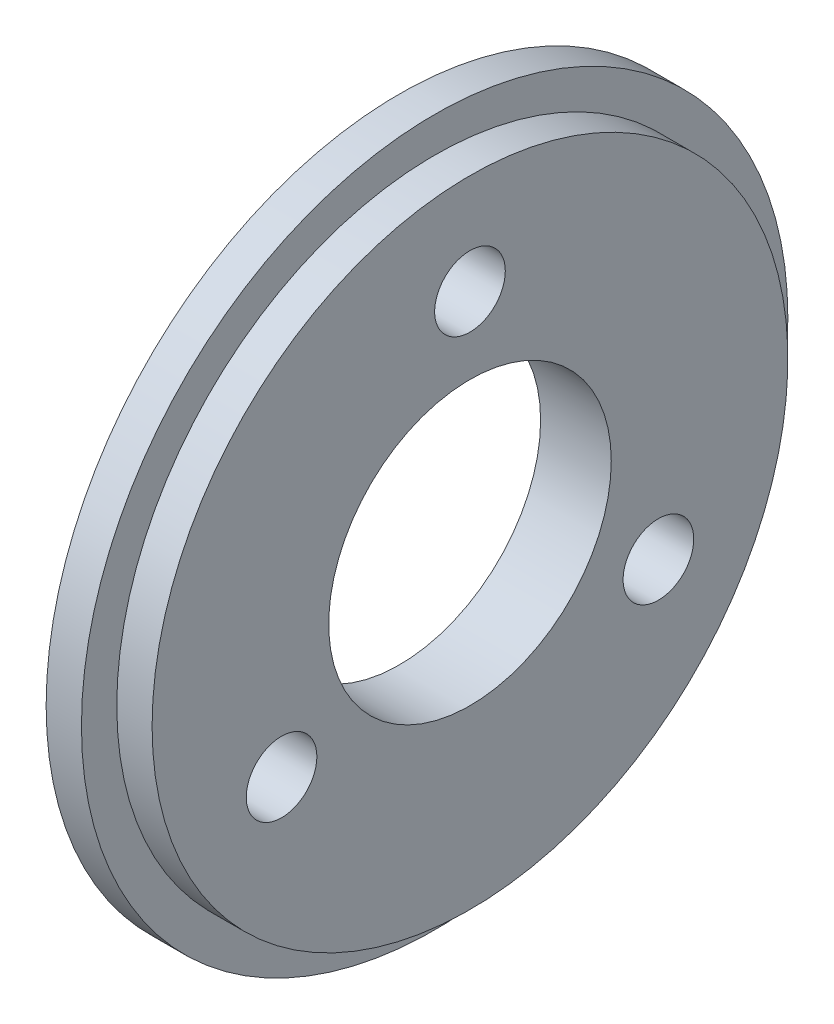
ISO-10303-21;
HEADER;
FILE_DESCRIPTION(('STEP AP214'),'2;1');
FILE_NAME('part.step','',(''),(''),'','','');
FILE_SCHEMA(('AUTOMOTIVE_DESIGN { 1 0 10303 214 1 1 1 1 }'));
ENDSEC;
DATA;
#1=APPLICATION_CONTEXT('core data for automotive mechanical design processes');
#2=APPLICATION_PROTOCOL_DEFINITION('international standard','automotive_design',2000,#1);
#3=PRODUCT_CONTEXT('',#1,'mechanical');
#4=PRODUCT('Part','Part','',(#3));
#5=PRODUCT_RELATED_PRODUCT_CATEGORY('part','',(#4));
#6=PRODUCT_DEFINITION_FORMATION('','',#4);
#7=PRODUCT_DEFINITION_CONTEXT('part definition',#1,'design');
#8=PRODUCT_DEFINITION('design','',#6,#7);
#9=PRODUCT_DEFINITION_SHAPE('','',#8);
#10=(LENGTH_UNIT() NAMED_UNIT(*) SI_UNIT(.MILLI.,.METRE.));
#11=(NAMED_UNIT(*) PLANE_ANGLE_UNIT() SI_UNIT($,.RADIAN.));
#12=(NAMED_UNIT(*) SI_UNIT($,.STERADIAN.) SOLID_ANGLE_UNIT());
#13=UNCERTAINTY_MEASURE_WITH_UNIT(LENGTH_MEASURE(1.E-05),#10,'distance_accuracy_value','');
#14=(GEOMETRIC_REPRESENTATION_CONTEXT(3) GLOBAL_UNCERTAINTY_ASSIGNED_CONTEXT((#13)) GLOBAL_UNIT_ASSIGNED_CONTEXT((#10,
#11,#12)) REPRESENTATION_CONTEXT('',''));
#15=CARTESIAN_POINT('',(0.,0.,0.));
#16=DIRECTION('',(0.,0.,1.));
#17=DIRECTION('',(1.,0.,0.));
#18=AXIS2_PLACEMENT_3D('',#15,#16,#17);
#19=CARTESIAN_POINT('',(-12.7,-19.5579999999986,-33.8754496944346));
#20=DIRECTION('',(1.,0.,0.));
#21=DIRECTION('',(0.,0.,-1.));
#22=AXIS2_PLACEMENT_3D('',#19,#20,#21);
#23=CYLINDRICAL_SURFACE('',#22,3.4925);
#24=CARTESIAN_POINT('',(-12.7,-19.5579999999986,-33.8754496944346));
#25=DIRECTION('',(1.,0.,0.));
#26=DIRECTION('',(0.,0.,-1.));
#27=AXIS2_PLACEMENT_3D('',#24,#25,#26);
#28=CIRCLE('',#27,3.4925);
#29=CARTESIAN_POINT('',(-12.7,-19.5579999999986,-37.3679496944346));
#30=VERTEX_POINT('',#29);
#31=EDGE_CURVE('E72',#30,#30,#28,.T.);
#32=ORIENTED_EDGE('',*,*,#31,.F.);
#33=EDGE_LOOP('',(#32));
#34=FACE_BOUND('',#33,.T.);
#35=CARTESIAN_POINT('',(-10.16,-19.5579999999986,-33.8754496944346));
#36=DIRECTION('',(1.,0.,0.));
#37=DIRECTION('',(0.,0.,-1.));
#38=AXIS2_PLACEMENT_3D('',#35,#36,#37);
#39=CIRCLE('',#38,3.4925);
#40=CARTESIAN_POINT('',(-10.16,-19.5579999999986,-37.3679496944346));
#41=VERTEX_POINT('',#40);
#42=EDGE_CURVE('E104',#41,#41,#39,.T.);
#43=ORIENTED_EDGE('',*,*,#42,.T.);
#44=EDGE_LOOP('',(#43));
#45=FACE_BOUND('',#44,.T.);
#46=ADVANCED_FACE('F43',(#34,#45),#23,.F.);
#47=CARTESIAN_POINT('',(-12.7,-19.5580000000014,33.8754496944296));
#48=DIRECTION('',(1.,0.,0.));
#49=DIRECTION('',(0.,0.,-1.));
#50=AXIS2_PLACEMENT_3D('',#47,#48,#49);
#51=CYLINDRICAL_SURFACE('',#50,3.4925);
#52=CARTESIAN_POINT('',(-12.7,-19.5580000000014,33.8754496944296));
#53=DIRECTION('',(1.,0.,0.));
#54=DIRECTION('',(0.,0.,-1.));
#55=AXIS2_PLACEMENT_3D('',#52,#53,#54);
#56=CIRCLE('',#55,3.4925);
#57=CARTESIAN_POINT('',(-12.7,-19.5580000000014,30.3829496944296));
#58=VERTEX_POINT('',#57);
#59=EDGE_CURVE('E68',#58,#58,#56,.T.);
#60=ORIENTED_EDGE('',*,*,#59,.F.);
#61=EDGE_LOOP('',(#60));
#62=FACE_BOUND('',#61,.T.);
#63=CARTESIAN_POINT('',(-10.16,-19.5580000000014,33.8754496944296));
#64=DIRECTION('',(1.,0.,0.));
#65=DIRECTION('',(0.,0.,-1.));
#66=AXIS2_PLACEMENT_3D('',#63,#64,#65);
#67=CIRCLE('',#66,3.4925);
#68=CARTESIAN_POINT('',(-10.16,-19.5580000000014,30.3829496944296));
#69=VERTEX_POINT('',#68);
#70=EDGE_CURVE('E92',#69,#69,#67,.T.);
#71=ORIENTED_EDGE('',*,*,#70,.T.);
#72=EDGE_LOOP('',(#71));
#73=FACE_BOUND('',#72,.T.);
#74=ADVANCED_FACE('F164',(#62,#73),#51,.F.);
#75=CARTESIAN_POINT('',(-12.7,39.116,0.));
#76=DIRECTION('',(1.,0.,0.));
#77=DIRECTION('',(0.,0.,-1.));
#78=AXIS2_PLACEMENT_3D('',#75,#76,#77);
#79=CYLINDRICAL_SURFACE('',#78,3.4925);
#80=CARTESIAN_POINT('',(-12.7,39.116,0.));
#81=DIRECTION('',(1.,0.,0.));
#82=DIRECTION('',(0.,0.,-1.));
#83=AXIS2_PLACEMENT_3D('',#80,#81,#82);
#84=CIRCLE('',#83,3.4925);
#85=CARTESIAN_POINT('',(-12.7,39.116,-3.4925));
#86=VERTEX_POINT('',#85);
#87=EDGE_CURVE('E67',#86,#86,#84,.T.);
#88=ORIENTED_EDGE('',*,*,#87,.F.);
#89=EDGE_LOOP('',(#88));
#90=FACE_BOUND('',#89,.T.);
#91=CARTESIAN_POINT('',(-10.16,39.116,0.));
#92=DIRECTION('',(1.,0.,0.));
#93=DIRECTION('',(0.,0.,-1.));
#94=AXIS2_PLACEMENT_3D('',#91,#92,#93);
#95=CIRCLE('',#94,3.4925);
#96=CARTESIAN_POINT('',(-10.16,39.116,-3.4925));
#97=VERTEX_POINT('',#96);
#98=EDGE_CURVE('E116',#97,#97,#95,.T.);
#99=ORIENTED_EDGE('',*,*,#98,.T.);
#100=EDGE_LOOP('',(#99));
#101=FACE_BOUND('',#100,.T.);
#102=ADVANCED_FACE('F124',(#90,#101),#79,.F.);
#103=CARTESIAN_POINT('',(0.,0.,0.));
#104=DIRECTION('',(-1.,0.,0.));
#105=DIRECTION('',(0.,0.,1.));
#106=AXIS2_PLACEMENT_3D('',#103,#104,#105);
#107=PLANE('',#106);
#108=CARTESIAN_POINT('',(0.,39.116,0.));
#109=DIRECTION('',(1.,0.,0.));
#110=DIRECTION('',(0.,0.,-1.));
#111=AXIS2_PLACEMENT_3D('',#108,#109,#110);
#112=CIRCLE('',#111,6.35);
#113=CARTESIAN_POINT('',(0.,39.116,-6.35));
#114=VERTEX_POINT('',#113);
#115=EDGE_CURVE('E109',#114,#114,#112,.T.);
#116=ORIENTED_EDGE('',*,*,#115,.F.);
#117=EDGE_LOOP('',(#116));
#118=FACE_BOUND('',#117,.T.);
#119=CARTESIAN_POINT('',(0.,-19.557999999999,-33.8754496944338));
#120=DIRECTION('',(1.,0.,0.));
#121=DIRECTION('',(0.,0.,-1.));
#122=AXIS2_PLACEMENT_3D('',#119,#120,#121);
#123=CIRCLE('',#122,6.35);
#124=CARTESIAN_POINT('',(0.,-19.557999999999,-40.2254496944338));
#125=VERTEX_POINT('',#124);
#126=EDGE_CURVE('E97',#125,#125,#123,.T.);
#127=ORIENTED_EDGE('',*,*,#126,.F.);
#128=EDGE_LOOP('',(#127));
#129=FACE_BOUND('',#128,.T.);
#130=CARTESIAN_POINT('',(0.,-19.5580000000009,33.8754496944305));
#131=DIRECTION('',(1.,0.,0.));
#132=DIRECTION('',(0.,0.,-1.));
#133=AXIS2_PLACEMENT_3D('',#130,#131,#132);
#134=CIRCLE('',#133,6.35);
#135=CARTESIAN_POINT('',(0.,-19.5580000000009,27.5254496944305));
#136=VERTEX_POINT('',#135);
#137=EDGE_CURVE('E88',#136,#136,#134,.T.);
#138=ORIENTED_EDGE('',*,*,#137,.F.);
#139=EDGE_LOOP('',(#138));
#140=FACE_BOUND('',#139,.T.);
#141=CARTESIAN_POINT('',(0.,0.,0.));
#142=DIRECTION('',(1.,0.,0.));
#143=DIRECTION('',(0.,0.,-1.));
#144=AXIS2_PLACEMENT_3D('',#141,#142,#143);
#145=CIRCLE('',#144,25.4);
#146=CARTESIAN_POINT('',(0.,0.,-25.4));
#147=VERTEX_POINT('',#146);
#148=EDGE_CURVE('E77',#147,#147,#145,.T.);
#149=ORIENTED_EDGE('',*,*,#148,.F.);
#150=EDGE_LOOP('',(#149));
#151=FACE_BOUND('',#150,.T.);
#152=CARTESIAN_POINT('',(0.,0.,0.));
#153=DIRECTION('',(-1.,0.,0.));
#154=DIRECTION('',(0.,0.,1.));
#155=AXIS2_PLACEMENT_3D('',#152,#153,#154);
#156=CIRCLE('',#155,57.15);
#157=CARTESIAN_POINT('',(0.,0.,57.15));
#158=VERTEX_POINT('',#157);
#159=EDGE_CURVE('E10',#158,#158,#156,.T.);
#160=ORIENTED_EDGE('',*,*,#159,.F.);
#161=EDGE_LOOP('',(#160));
#162=FACE_BOUND('',#161,.T.);
#163=ADVANCED_FACE('F45',(#118,#129,#140,#151,#162),#107,.F.);
#164=CARTESIAN_POINT('',(0.,0.,0.));
#165=DIRECTION('',(-1.,0.,0.));
#166=DIRECTION('',(0.,0.,1.));
#167=AXIS2_PLACEMENT_3D('',#164,#165,#166);
#168=CYLINDRICAL_SURFACE('',#167,57.15);
#169=CARTESIAN_POINT('',(-6.35,0.,0.));
#170=DIRECTION('',(-1.,0.,0.));
#171=DIRECTION('',(0.,0.,1.));
#172=AXIS2_PLACEMENT_3D('',#169,#170,#171);
#173=CIRCLE('',#172,57.15);
#174=CARTESIAN_POINT('',(-6.35,0.,57.15));
#175=VERTEX_POINT('',#174);
#176=EDGE_CURVE('E51',#175,#175,#173,.T.);
#177=ORIENTED_EDGE('',*,*,#176,.F.);
#178=EDGE_LOOP('',(#177));
#179=FACE_BOUND('',#178,.T.);
#180=ORIENTED_EDGE('',*,*,#159,.T.);
#181=EDGE_LOOP('',(#180));
#182=FACE_BOUND('',#181,.T.);
#183=ADVANCED_FACE('F142',(#179,#182),#168,.T.);
#184=CARTESIAN_POINT('',(-6.35,57.15,0.));
#185=DIRECTION('',(-1.,0.,0.));
#186=DIRECTION('',(0.,0.,1.));
#187=AXIS2_PLACEMENT_3D('',#184,#185,#186);
#188=PLANE('',#187);
#189=CARTESIAN_POINT('',(-6.35,0.,0.));
#190=DIRECTION('',(-1.,0.,0.));
#191=DIRECTION('',(0.,0.,1.));
#192=AXIS2_PLACEMENT_3D('',#189,#190,#191);
#193=CIRCLE('',#192,63.5);
#194=CARTESIAN_POINT('',(-6.35,0.,63.5));
#195=VERTEX_POINT('',#194);
#196=EDGE_CURVE('E56',#195,#195,#193,.T.);
#197=ORIENTED_EDGE('',*,*,#196,.F.);
#198=EDGE_LOOP('',(#197));
#199=FACE_BOUND('',#198,.T.);
#200=ORIENTED_EDGE('',*,*,#176,.T.);
#201=EDGE_LOOP('',(#200));
#202=FACE_BOUND('',#201,.T.);
#203=ADVANCED_FACE('F176',(#199,#202),#188,.F.);
#204=CARTESIAN_POINT('',(0.,0.,0.));
#205=DIRECTION('',(-1.,0.,0.));
#206=DIRECTION('',(0.,0.,1.));
#207=AXIS2_PLACEMENT_3D('',#204,#205,#206);
#208=CYLINDRICAL_SURFACE('',#207,63.5);
#209=CARTESIAN_POINT('',(-12.7,0.,0.));
#210=DIRECTION('',(-1.,0.,0.));
#211=DIRECTION('',(0.,0.,1.));
#212=AXIS2_PLACEMENT_3D('',#209,#210,#211);
#213=CIRCLE('',#212,63.5);
#214=CARTESIAN_POINT('',(-12.7,0.,63.5));
#215=VERTEX_POINT('',#214);
#216=EDGE_CURVE('E61',#215,#215,#213,.T.);
#217=ORIENTED_EDGE('',*,*,#216,.F.);
#218=EDGE_LOOP('',(#217));
#219=FACE_BOUND('',#218,.T.);
#220=ORIENTED_EDGE('',*,*,#196,.T.);
#221=EDGE_LOOP('',(#220));
#222=FACE_BOUND('',#221,.T.);
#223=ADVANCED_FACE('F158',(#219,#222),#208,.T.);
#224=CARTESIAN_POINT('',(-12.7,63.5,0.));
#225=DIRECTION('',(1.,0.,0.));
#226=DIRECTION('',(0.,0.,-1.));
#227=AXIS2_PLACEMENT_3D('',#224,#225,#226);
#228=PLANE('',#227);
#229=ORIENTED_EDGE('',*,*,#87,.T.);
#230=EDGE_LOOP('',(#229));
#231=FACE_BOUND('',#230,.T.);
#232=CARTESIAN_POINT('',(-12.7,0.,0.));
#233=DIRECTION('',(1.,0.,0.));
#234=DIRECTION('',(0.,0.,-1.));
#235=AXIS2_PLACEMENT_3D('',#232,#233,#234);
#236=CIRCLE('',#235,25.4);
#237=CARTESIAN_POINT('',(-12.7,0.,-25.4));
#238=VERTEX_POINT('',#237);
#239=EDGE_CURVE('E73',#238,#238,#236,.T.);
#240=ORIENTED_EDGE('',*,*,#239,.T.);
#241=EDGE_LOOP('',(#240));
#242=FACE_BOUND('',#241,.T.);
#243=ORIENTED_EDGE('',*,*,#59,.T.);
#244=EDGE_LOOP('',(#243));
#245=FACE_BOUND('',#244,.T.);
#246=ORIENTED_EDGE('',*,*,#31,.T.);
#247=EDGE_LOOP('',(#246));
#248=FACE_BOUND('',#247,.T.);
#249=ORIENTED_EDGE('',*,*,#216,.T.);
#250=EDGE_LOOP('',(#249));
#251=FACE_BOUND('',#250,.T.);
#252=ADVANCED_FACE('F151',(#231,#242,#245,#248,#251),#228,.F.);
#253=CARTESIAN_POINT('',(-12.7,0.,0.));
#254=DIRECTION('',(1.,0.,0.));
#255=DIRECTION('',(0.,0.,-1.));
#256=AXIS2_PLACEMENT_3D('',#253,#254,#255);
#257=CYLINDRICAL_SURFACE('',#256,25.4);
#258=ORIENTED_EDGE('',*,*,#239,.F.);
#259=EDGE_LOOP('',(#258));
#260=FACE_BOUND('',#259,.T.);
#261=ORIENTED_EDGE('',*,*,#148,.T.);
#262=EDGE_LOOP('',(#261));
#263=FACE_BOUND('',#262,.T.);
#264=ADVANCED_FACE('F136',(#260,#263),#257,.F.);
#265=CARTESIAN_POINT('',(-10.16,39.116,0.));
#266=DIRECTION('',(1.,0.,0.));
#267=DIRECTION('',(0.,0.,-1.));
#268=AXIS2_PLACEMENT_3D('',#265,#266,#267);
#269=CYLINDRICAL_SURFACE('',#268,6.35);
#270=CARTESIAN_POINT('',(-10.16,39.116,0.));
#271=DIRECTION('',(1.,0.,0.));
#272=DIRECTION('',(0.,0.,-1.));
#273=AXIS2_PLACEMENT_3D('',#270,#271,#272);
#274=CIRCLE('',#273,6.35);
#275=CARTESIAN_POINT('',(-10.16,39.116,-6.35));
#276=VERTEX_POINT('',#275);
#277=EDGE_CURVE('E81',#276,#276,#274,.T.);
#278=ORIENTED_EDGE('',*,*,#277,.F.);
#279=EDGE_LOOP('',(#278));
#280=FACE_BOUND('',#279,.T.);
#281=ORIENTED_EDGE('',*,*,#115,.T.);
#282=EDGE_LOOP('',(#281));
#283=FACE_BOUND('',#282,.T.);
#284=ADVANCED_FACE('F130',(#280,#283),#269,.F.);
#285=CARTESIAN_POINT('',(-10.16,0.,0.));
#286=DIRECTION('',(1.,0.,0.));
#287=DIRECTION('',(0.,0.,-1.));
#288=AXIS2_PLACEMENT_3D('',#285,#286,#287);
#289=PLANE('',#288);
#290=ORIENTED_EDGE('',*,*,#98,.F.);
#291=EDGE_LOOP('',(#290));
#292=FACE_BOUND('',#291,.T.);
#293=ORIENTED_EDGE('',*,*,#277,.T.);
#294=EDGE_LOOP('',(#293));
#295=FACE_BOUND('',#294,.T.);
#296=ADVANCED_FACE('F126',(#292,#295),#289,.T.);
#297=CARTESIAN_POINT('',(-10.16,-19.5580000000009,33.8754496944305));
#298=DIRECTION('',(1.,0.,0.));
#299=DIRECTION('',(0.,0.,-1.));
#300=AXIS2_PLACEMENT_3D('',#297,#298,#299);
#301=CYLINDRICAL_SURFACE('',#300,6.35);
#302=CARTESIAN_POINT('',(-10.16,-19.5580000000009,33.8754496944305));
#303=DIRECTION('',(1.,0.,0.));
#304=DIRECTION('',(0.,0.,-1.));
#305=AXIS2_PLACEMENT_3D('',#302,#303,#304);
#306=CIRCLE('',#305,6.35);
#307=CARTESIAN_POINT('',(-10.16,-19.5580000000009,27.5254496944305));
#308=VERTEX_POINT('',#307);
#309=EDGE_CURVE('E93',#308,#308,#306,.T.);
#310=ORIENTED_EDGE('',*,*,#309,.F.);
#311=EDGE_LOOP('',(#310));
#312=FACE_BOUND('',#311,.T.);
#313=ORIENTED_EDGE('',*,*,#137,.T.);
#314=EDGE_LOOP('',(#313));
#315=FACE_BOUND('',#314,.T.);
#316=ADVANCED_FACE('F129',(#312,#315),#301,.F.);
#317=CARTESIAN_POINT('',(-10.16,0.,0.));
#318=DIRECTION('',(1.,0.,0.));
#319=DIRECTION('',(0.,0.,-1.));
#320=AXIS2_PLACEMENT_3D('',#317,#318,#319);
#321=PLANE('',#320);
#322=ORIENTED_EDGE('',*,*,#70,.F.);
#323=EDGE_LOOP('',(#322));
#324=FACE_BOUND('',#323,.T.);
#325=ORIENTED_EDGE('',*,*,#309,.T.);
#326=EDGE_LOOP('',(#325));
#327=FACE_BOUND('',#326,.T.);
#328=ADVANCED_FACE('F242',(#324,#327),#321,.T.);
#329=CARTESIAN_POINT('',(-10.16,-19.557999999999,-33.8754496944338));
#330=DIRECTION('',(1.,0.,0.));
#331=DIRECTION('',(0.,0.,-1.));
#332=AXIS2_PLACEMENT_3D('',#329,#330,#331);
#333=CYLINDRICAL_SURFACE('',#332,6.35);
#334=CARTESIAN_POINT('',(-10.16,-19.557999999999,-33.8754496944338));
#335=DIRECTION('',(1.,0.,0.));
#336=DIRECTION('',(0.,0.,-1.));
#337=AXIS2_PLACEMENT_3D('',#334,#335,#336);
#338=CIRCLE('',#337,6.35);
#339=CARTESIAN_POINT('',(-10.16,-19.557999999999,-40.2254496944338));
#340=VERTEX_POINT('',#339);
#341=EDGE_CURVE('E105',#340,#340,#338,.T.);
#342=ORIENTED_EDGE('',*,*,#341,.F.);
#343=EDGE_LOOP('',(#342));
#344=FACE_BOUND('',#343,.T.);
#345=ORIENTED_EDGE('',*,*,#126,.T.);
#346=EDGE_LOOP('',(#345));
#347=FACE_BOUND('',#346,.T.);
#348=ADVANCED_FACE('F252',(#344,#347),#333,.F.);
#349=CARTESIAN_POINT('',(-10.16,0.,0.));
#350=DIRECTION('',(1.,0.,0.));
#351=DIRECTION('',(0.,0.,-1.));
#352=AXIS2_PLACEMENT_3D('',#349,#350,#351);
#353=PLANE('',#352);
#354=ORIENTED_EDGE('',*,*,#42,.F.);
#355=EDGE_LOOP('',(#354));
#356=FACE_BOUND('',#355,.T.);
#357=ORIENTED_EDGE('',*,*,#341,.T.);
#358=EDGE_LOOP('',(#357));
#359=FACE_BOUND('',#358,.T.);
#360=ADVANCED_FACE('F262',(#356,#359),#353,.T.);
#361=CLOSED_SHELL('',(#46,#74,#102,#163,#183,#203,#223,#252,#264,#284,#296,#316,#328,#348,#360));
#362=MANIFOLD_SOLID_BREP('B2',#361);
#363=ADVANCED_BREP_SHAPE_REPRESENTATION('',(#18,#362),#14);
#364=SHAPE_DEFINITION_REPRESENTATION(#9,#363);
ENDSEC;
END-ISO-10303-21;
